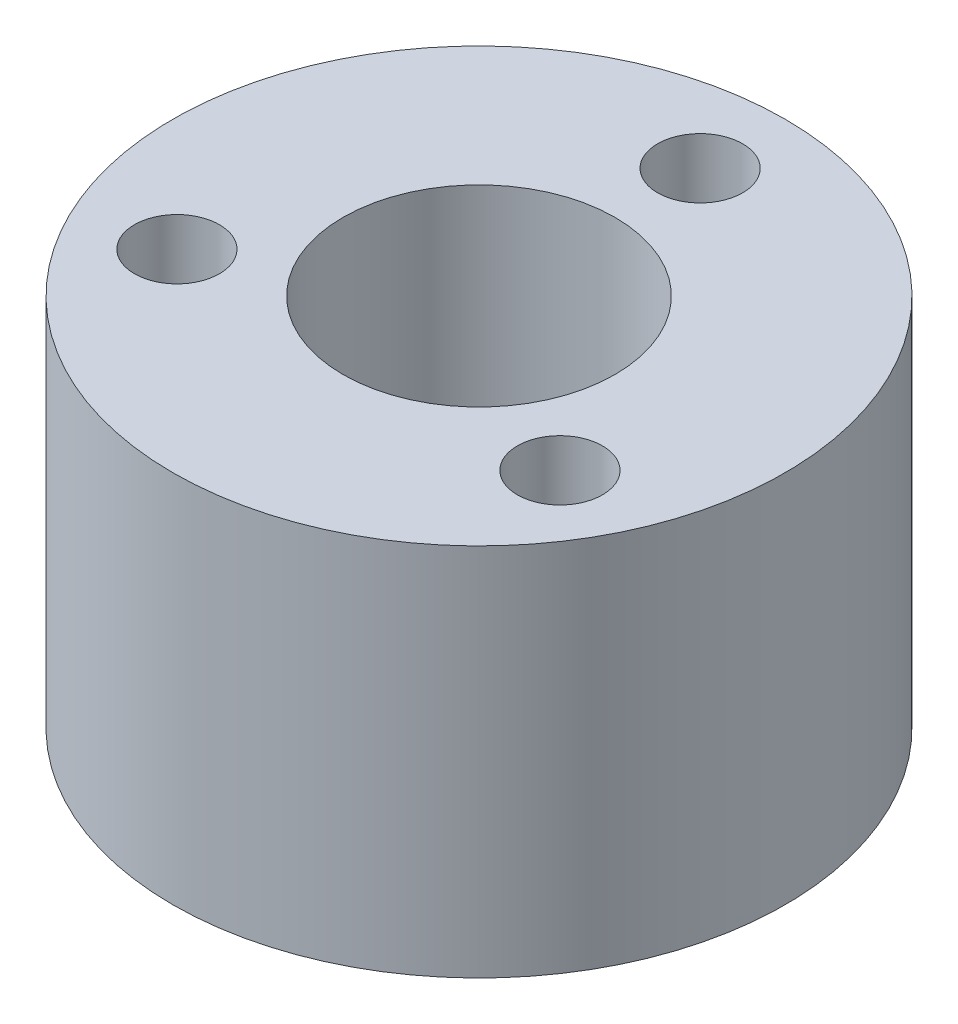
ISO-10303-21;
HEADER;
FILE_DESCRIPTION(('STEP AP214'),'2;1');
FILE_NAME('part.step','',(''),(''),'','','');
FILE_SCHEMA(('AUTOMOTIVE_DESIGN { 1 0 10303 214 1 1 1 1 }'));
ENDSEC;
DATA;
#1=APPLICATION_CONTEXT('core data for automotive mechanical design processes');
#2=APPLICATION_PROTOCOL_DEFINITION('international standard','automotive_design',2000,#1);
#3=PRODUCT_CONTEXT('',#1,'mechanical');
#4=PRODUCT('Part','Part','',(#3));
#5=PRODUCT_RELATED_PRODUCT_CATEGORY('part','',(#4));
#6=PRODUCT_DEFINITION_FORMATION('','',#4);
#7=PRODUCT_DEFINITION_CONTEXT('part definition',#1,'design');
#8=PRODUCT_DEFINITION('design','',#6,#7);
#9=PRODUCT_DEFINITION_SHAPE('','',#8);
#10=(LENGTH_UNIT() NAMED_UNIT(*) SI_UNIT(.MILLI.,.METRE.));
#11=(NAMED_UNIT(*) PLANE_ANGLE_UNIT() SI_UNIT($,.RADIAN.));
#12=(NAMED_UNIT(*) SI_UNIT($,.STERADIAN.) SOLID_ANGLE_UNIT());
#13=UNCERTAINTY_MEASURE_WITH_UNIT(LENGTH_MEASURE(1.E-05),#10,'distance_accuracy_value','');
#14=(GEOMETRIC_REPRESENTATION_CONTEXT(3) GLOBAL_UNCERTAINTY_ASSIGNED_CONTEXT((#13)) GLOBAL_UNIT_ASSIGNED_CONTEXT((#10,
#11,#12)) REPRESENTATION_CONTEXT('',''));
#15=CARTESIAN_POINT('',(0.,0.,0.));
#16=DIRECTION('',(0.,0.,1.));
#17=DIRECTION('',(1.,0.,0.));
#18=AXIS2_PLACEMENT_3D('',#15,#16,#17);
#19=CARTESIAN_POINT('',(0.,11.,0.));
#20=DIRECTION('',(0.,1.,0.));
#21=DIRECTION('',(0.,0.,1.));
#22=AXIS2_PLACEMENT_3D('',#19,#20,#21);
#23=PLANE('',#22);
#24=CARTESIAN_POINT('',(5.62916512459913,11.,3.24999999999984));
#25=DIRECTION('',(0.,1.,0.));
#26=DIRECTION('',(0.,0.,1.));
#27=AXIS2_PLACEMENT_3D('',#24,#25,#26);
#28=CIRCLE('',#27,1.25000000000025);
#29=CARTESIAN_POINT('',(5.62916512459913,11.,4.50000000000009));
#30=VERTEX_POINT('',#29);
#31=EDGE_CURVE('E56',#30,#30,#28,.T.);
#32=ORIENTED_EDGE('',*,*,#31,.F.);
#33=EDGE_LOOP('',(#32));
#34=FACE_BOUND('',#33,.T.);
#35=CARTESIAN_POINT('',(0.,11.,0.));
#36=DIRECTION('',(0.,1.,0.));
#37=DIRECTION('',(0.,0.,1.));
#38=AXIS2_PLACEMENT_3D('',#35,#36,#37);
#39=CIRCLE('',#38,4.);
#40=CARTESIAN_POINT('',(0.,11.,4.));
#41=VERTEX_POINT('',#40);
#42=EDGE_CURVE('E48',#41,#41,#39,.T.);
#43=ORIENTED_EDGE('',*,*,#42,.F.);
#44=EDGE_LOOP('',(#43));
#45=FACE_BOUND('',#44,.T.);
#46=CARTESIAN_POINT('',(0.,11.,0.));
#47=DIRECTION('',(0.,1.,0.));
#48=DIRECTION('',(0.,0.,1.));
#49=AXIS2_PLACEMENT_3D('',#46,#47,#48);
#50=CIRCLE('',#49,9.);
#51=CARTESIAN_POINT('',(0.,11.,9.));
#52=VERTEX_POINT('',#51);
#53=EDGE_CURVE('E10',#52,#52,#50,.T.);
#54=ORIENTED_EDGE('',*,*,#53,.T.);
#55=EDGE_LOOP('',(#54));
#56=FACE_BOUND('',#55,.T.);
#57=CARTESIAN_POINT('',(0.,11.,-6.5));
#58=DIRECTION('',(0.,1.,0.));
#59=DIRECTION('',(0.,0.,1.));
#60=AXIS2_PLACEMENT_3D('',#57,#58,#59);
#61=CIRCLE('',#60,1.25);
#62=CARTESIAN_POINT('',(0.,11.,-5.25));
#63=VERTEX_POINT('',#62);
#64=EDGE_CURVE('E52',#63,#63,#61,.T.);
#65=ORIENTED_EDGE('',*,*,#64,.F.);
#66=EDGE_LOOP('',(#65));
#67=FACE_BOUND('',#66,.T.);
#68=CARTESIAN_POINT('',(-5.62916512459858,11.,3.25000000000016));
#69=DIRECTION('',(0.,1.,0.));
#70=DIRECTION('',(0.,0.,1.));
#71=AXIS2_PLACEMENT_3D('',#68,#69,#70);
#72=CIRCLE('',#71,1.25000000000036);
#73=CARTESIAN_POINT('',(-5.62916512459858,11.,4.50000000000052));
#74=VERTEX_POINT('',#73);
#75=EDGE_CURVE('E61',#74,#74,#72,.T.);
#76=ORIENTED_EDGE('',*,*,#75,.F.);
#77=EDGE_LOOP('',(#76));
#78=FACE_BOUND('',#77,.T.);
#79=ADVANCED_FACE('F40',(#34,#45,#56,#67,#78),#23,.T.);
#80=CARTESIAN_POINT('',(0.,0.,0.));
#81=DIRECTION('',(0.,1.,0.));
#82=DIRECTION('',(0.,0.,1.));
#83=AXIS2_PLACEMENT_3D('',#80,#81,#82);
#84=PLANE('',#83);
#85=CARTESIAN_POINT('',(0.,0.,0.));
#86=DIRECTION('',(0.,1.,0.));
#87=DIRECTION('',(0.,0.,1.));
#88=AXIS2_PLACEMENT_3D('',#85,#86,#87);
#89=CIRCLE('',#88,9.);
#90=CARTESIAN_POINT('',(0.,0.,9.));
#91=VERTEX_POINT('',#90);
#92=EDGE_CURVE('E41',#91,#91,#89,.T.);
#93=ORIENTED_EDGE('',*,*,#92,.F.);
#94=EDGE_LOOP('',(#93));
#95=FACE_BOUND('',#94,.T.);
#96=CARTESIAN_POINT('',(0.,0.,0.));
#97=DIRECTION('',(0.,1.,0.));
#98=DIRECTION('',(0.,0.,1.));
#99=AXIS2_PLACEMENT_3D('',#96,#97,#98);
#100=CIRCLE('',#99,4.);
#101=CARTESIAN_POINT('',(0.,0.,4.));
#102=VERTEX_POINT('',#101);
#103=EDGE_CURVE('E49',#102,#102,#100,.T.);
#104=ORIENTED_EDGE('',*,*,#103,.T.);
#105=EDGE_LOOP('',(#104));
#106=FACE_BOUND('',#105,.T.);
#107=CARTESIAN_POINT('',(0.,0.,-6.5));
#108=DIRECTION('',(0.,1.,0.));
#109=DIRECTION('',(0.,0.,1.));
#110=AXIS2_PLACEMENT_3D('',#107,#108,#109);
#111=CIRCLE('',#110,1.25);
#112=CARTESIAN_POINT('',(0.,0.,-5.25));
#113=VERTEX_POINT('',#112);
#114=EDGE_CURVE('E57',#113,#113,#111,.T.);
#115=ORIENTED_EDGE('',*,*,#114,.T.);
#116=EDGE_LOOP('',(#115));
#117=FACE_BOUND('',#116,.T.);
#118=CARTESIAN_POINT('',(5.62916512459913,0.,3.24999999999984));
#119=DIRECTION('',(0.,1.,0.));
#120=DIRECTION('',(0.,0.,1.));
#121=AXIS2_PLACEMENT_3D('',#118,#119,#120);
#122=CIRCLE('',#121,1.25000000000025);
#123=CARTESIAN_POINT('',(5.62916512459913,0.,4.50000000000009));
#124=VERTEX_POINT('',#123);
#125=EDGE_CURVE('E64',#124,#124,#122,.T.);
#126=ORIENTED_EDGE('',*,*,#125,.T.);
#127=EDGE_LOOP('',(#126));
#128=FACE_BOUND('',#127,.T.);
#129=CARTESIAN_POINT('',(-5.62916512459858,0.,3.25000000000016));
#130=DIRECTION('',(0.,1.,0.));
#131=DIRECTION('',(0.,0.,1.));
#132=AXIS2_PLACEMENT_3D('',#129,#130,#131);
#133=CIRCLE('',#132,1.25000000000036);
#134=CARTESIAN_POINT('',(-5.62916512459858,0.,4.50000000000052));
#135=VERTEX_POINT('',#134);
#136=EDGE_CURVE('E66',#135,#135,#133,.T.);
#137=ORIENTED_EDGE('',*,*,#136,.T.);
#138=EDGE_LOOP('',(#137));
#139=FACE_BOUND('',#138,.T.);
#140=ADVANCED_FACE('F76',(#95,#106,#117,#128,#139),#84,.F.);
#141=CARTESIAN_POINT('',(0.,11.,0.));
#142=DIRECTION('',(0.,-1.,0.));
#143=DIRECTION('',(0.,0.,-1.));
#144=AXIS2_PLACEMENT_3D('',#141,#142,#143);
#145=CYLINDRICAL_SURFACE('',#144,9.);
#146=ORIENTED_EDGE('',*,*,#53,.F.);
#147=EDGE_LOOP('',(#146));
#148=FACE_BOUND('',#147,.T.);
#149=ORIENTED_EDGE('',*,*,#92,.T.);
#150=EDGE_LOOP('',(#149));
#151=FACE_BOUND('',#150,.T.);
#152=ADVANCED_FACE('F39',(#148,#151),#145,.T.);
#153=CARTESIAN_POINT('',(0.,11.,0.));
#154=DIRECTION('',(0.,-1.,0.));
#155=DIRECTION('',(0.,0.,-1.));
#156=AXIS2_PLACEMENT_3D('',#153,#154,#155);
#157=CYLINDRICAL_SURFACE('',#156,4.);
#158=ORIENTED_EDGE('',*,*,#42,.T.);
#159=EDGE_LOOP('',(#158));
#160=FACE_BOUND('',#159,.T.);
#161=ORIENTED_EDGE('',*,*,#103,.F.);
#162=EDGE_LOOP('',(#161));
#163=FACE_BOUND('',#162,.T.);
#164=ADVANCED_FACE('F88',(#160,#163),#157,.F.);
#165=CARTESIAN_POINT('',(0.,11.,-6.5));
#166=DIRECTION('',(0.,-1.,0.));
#167=DIRECTION('',(0.,0.,-1.));
#168=AXIS2_PLACEMENT_3D('',#165,#166,#167);
#169=CYLINDRICAL_SURFACE('',#168,1.25);
#170=ORIENTED_EDGE('',*,*,#64,.T.);
#171=EDGE_LOOP('',(#170));
#172=FACE_BOUND('',#171,.T.);
#173=ORIENTED_EDGE('',*,*,#114,.F.);
#174=EDGE_LOOP('',(#173));
#175=FACE_BOUND('',#174,.T.);
#176=ADVANCED_FACE('F91',(#172,#175),#169,.F.);
#177=CARTESIAN_POINT('',(5.62916512459913,11.,3.24999999999984));
#178=DIRECTION('',(0.,-1.,0.));
#179=DIRECTION('',(0.,0.,-1.));
#180=AXIS2_PLACEMENT_3D('',#177,#178,#179);
#181=CYLINDRICAL_SURFACE('',#180,1.25000000000025);
#182=ORIENTED_EDGE('',*,*,#31,.T.);
#183=EDGE_LOOP('',(#182));
#184=FACE_BOUND('',#183,.T.);
#185=ORIENTED_EDGE('',*,*,#125,.F.);
#186=EDGE_LOOP('',(#185));
#187=FACE_BOUND('',#186,.T.);
#188=ADVANCED_FACE('F94',(#184,#187),#181,.F.);
#189=CARTESIAN_POINT('',(-5.62916512459858,11.,3.25000000000016));
#190=DIRECTION('',(0.,-1.,0.));
#191=DIRECTION('',(0.,0.,-1.));
#192=AXIS2_PLACEMENT_3D('',#189,#190,#191);
#193=CYLINDRICAL_SURFACE('',#192,1.25000000000036);
#194=ORIENTED_EDGE('',*,*,#75,.T.);
#195=EDGE_LOOP('',(#194));
#196=FACE_BOUND('',#195,.T.);
#197=ORIENTED_EDGE('',*,*,#136,.F.);
#198=EDGE_LOOP('',(#197));
#199=FACE_BOUND('',#198,.T.);
#200=ADVANCED_FACE('F75',(#196,#199),#193,.F.);
#201=CLOSED_SHELL('',(#79,#140,#152,#164,#176,#188,#200));
#202=MANIFOLD_SOLID_BREP('B2',#201);
#203=ADVANCED_BREP_SHAPE_REPRESENTATION('',(#18,#202),#14);
#204=SHAPE_DEFINITION_REPRESENTATION(#9,#203);
ENDSEC;
END-ISO-10303-21;
